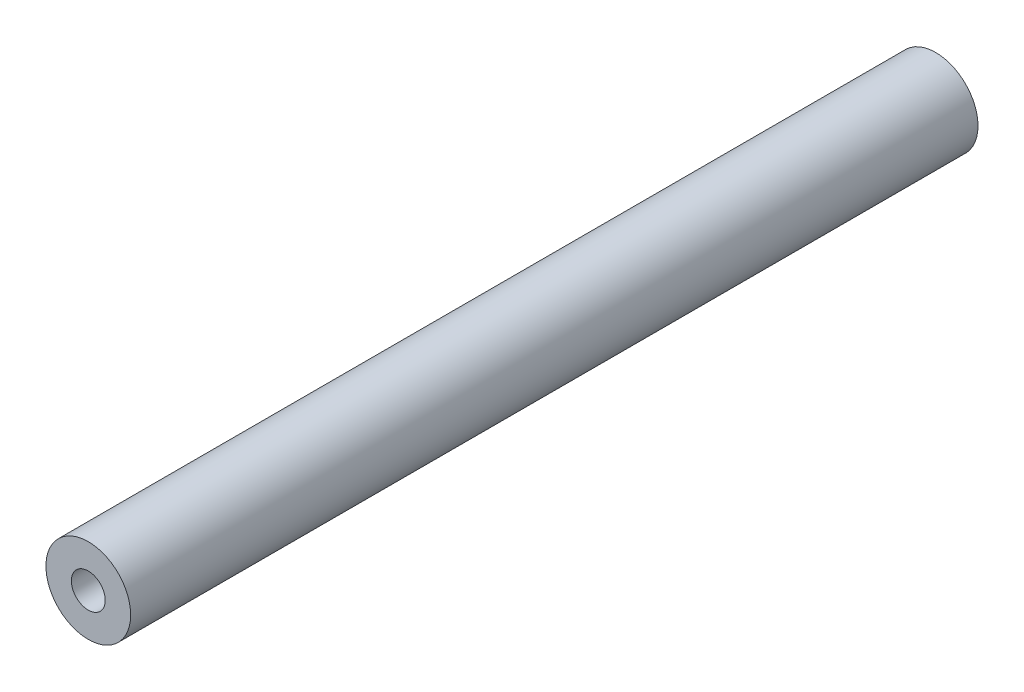
ISO-10303-21;
HEADER;
FILE_DESCRIPTION(('STEP AP214'),'2;1');
FILE_NAME('part.step','',(''),(''),'','','');
FILE_SCHEMA(('AUTOMOTIVE_DESIGN { 1 0 10303 214 1 1 1 1 }'));
ENDSEC;
DATA;
#1=APPLICATION_CONTEXT('core data for automotive mechanical design processes');
#2=APPLICATION_PROTOCOL_DEFINITION('international standard','automotive_design',2000,#1);
#3=PRODUCT_CONTEXT('',#1,'mechanical');
#4=PRODUCT('Part','Part','',(#3));
#5=PRODUCT_RELATED_PRODUCT_CATEGORY('part','',(#4));
#6=PRODUCT_DEFINITION_FORMATION('','',#4);
#7=PRODUCT_DEFINITION_CONTEXT('part definition',#1,'design');
#8=PRODUCT_DEFINITION('design','',#6,#7);
#9=PRODUCT_DEFINITION_SHAPE('','',#8);
#10=(LENGTH_UNIT() NAMED_UNIT(*) SI_UNIT(.MILLI.,.METRE.));
#11=(NAMED_UNIT(*) PLANE_ANGLE_UNIT() SI_UNIT($,.RADIAN.));
#12=(NAMED_UNIT(*) SI_UNIT($,.STERADIAN.) SOLID_ANGLE_UNIT());
#13=UNCERTAINTY_MEASURE_WITH_UNIT(LENGTH_MEASURE(1.E-05),#10,'distance_accuracy_value','');
#14=(GEOMETRIC_REPRESENTATION_CONTEXT(3) GLOBAL_UNCERTAINTY_ASSIGNED_CONTEXT((#13)) GLOBAL_UNIT_ASSIGNED_CONTEXT((#10,
#11,#12)) REPRESENTATION_CONTEXT('',''));
#15=CARTESIAN_POINT('',(0.,0.,0.));
#16=DIRECTION('',(0.,0.,1.));
#17=DIRECTION('',(1.,0.,0.));
#18=AXIS2_PLACEMENT_3D('',#15,#16,#17);
#19=CARTESIAN_POINT('',(0.,0.,60.));
#20=DIRECTION('',(0.,0.,1.));
#21=DIRECTION('',(1.,0.,0.));
#22=AXIS2_PLACEMENT_3D('',#19,#20,#21);
#23=PLANE('',#22);
#24=CARTESIAN_POINT('',(0.,0.,60.));
#25=DIRECTION('',(0.,0.,1.));
#26=DIRECTION('',(1.,0.,0.));
#27=AXIS2_PLACEMENT_3D('',#24,#25,#26);
#28=CIRCLE('',#27,3.);
#29=CARTESIAN_POINT('',(3.,0.,60.));
#30=VERTEX_POINT('',#29);
#31=EDGE_CURVE('E11',#30,#30,#28,.T.);
#32=ORIENTED_EDGE('',*,*,#31,.T.);
#33=EDGE_LOOP('',(#32));
#34=FACE_BOUND('',#33,.T.);
#35=CARTESIAN_POINT('',(0.,0.,60.));
#36=DIRECTION('',(0.,0.,1.));
#37=DIRECTION('',(1.,0.,0.));
#38=AXIS2_PLACEMENT_3D('',#35,#36,#37);
#39=CIRCLE('',#38,1.2);
#40=CARTESIAN_POINT('',(1.2,0.,60.));
#41=VERTEX_POINT('',#40);
#42=EDGE_CURVE('E48',#41,#41,#39,.T.);
#43=ORIENTED_EDGE('',*,*,#42,.F.);
#44=EDGE_LOOP('',(#43));
#45=FACE_BOUND('',#44,.T.);
#46=ADVANCED_FACE('F37',(#34,#45),#23,.T.);
#47=CARTESIAN_POINT('',(0.,0.,0.));
#48=DIRECTION('',(0.,0.,1.));
#49=DIRECTION('',(1.,0.,0.));
#50=AXIS2_PLACEMENT_3D('',#47,#48,#49);
#51=PLANE('',#50);
#52=CARTESIAN_POINT('',(0.,0.,0.));
#53=DIRECTION('',(0.,0.,1.));
#54=DIRECTION('',(1.,0.,0.));
#55=AXIS2_PLACEMENT_3D('',#52,#53,#54);
#56=CIRCLE('',#55,3.);
#57=CARTESIAN_POINT('',(3.,0.,0.));
#58=VERTEX_POINT('',#57);
#59=EDGE_CURVE('E41',#58,#58,#56,.T.);
#60=ORIENTED_EDGE('',*,*,#59,.F.);
#61=EDGE_LOOP('',(#60));
#62=FACE_BOUND('',#61,.T.);
#63=CARTESIAN_POINT('',(0.,0.,0.));
#64=DIRECTION('',(0.,0.,1.));
#65=DIRECTION('',(1.,0.,0.));
#66=AXIS2_PLACEMENT_3D('',#63,#64,#65);
#67=CIRCLE('',#66,1.2);
#68=CARTESIAN_POINT('',(1.2,0.,0.));
#69=VERTEX_POINT('',#68);
#70=EDGE_CURVE('E50',#69,#69,#67,.T.);
#71=ORIENTED_EDGE('',*,*,#70,.T.);
#72=EDGE_LOOP('',(#71));
#73=FACE_BOUND('',#72,.T.);
#74=ADVANCED_FACE('F60',(#62,#73),#51,.F.);
#75=CARTESIAN_POINT('',(0.,0.,60.));
#76=DIRECTION('',(0.,0.,-1.));
#77=DIRECTION('',(-1.,0.,0.));
#78=AXIS2_PLACEMENT_3D('',#75,#76,#77);
#79=CYLINDRICAL_SURFACE('',#78,3.);
#80=ORIENTED_EDGE('',*,*,#31,.F.);
#81=EDGE_LOOP('',(#80));
#82=FACE_BOUND('',#81,.T.);
#83=ORIENTED_EDGE('',*,*,#59,.T.);
#84=EDGE_LOOP('',(#83));
#85=FACE_BOUND('',#84,.T.);
#86=ADVANCED_FACE('F39',(#82,#85),#79,.T.);
#87=CARTESIAN_POINT('',(0.,0.,60.));
#88=DIRECTION('',(0.,0.,-1.));
#89=DIRECTION('',(-1.,0.,0.));
#90=AXIS2_PLACEMENT_3D('',#87,#88,#89);
#91=CYLINDRICAL_SURFACE('',#90,1.2);
#92=ORIENTED_EDGE('',*,*,#42,.T.);
#93=EDGE_LOOP('',(#92));
#94=FACE_BOUND('',#93,.T.);
#95=ORIENTED_EDGE('',*,*,#70,.F.);
#96=EDGE_LOOP('',(#95));
#97=FACE_BOUND('',#96,.T.);
#98=ADVANCED_FACE('F56',(#94,#97),#91,.F.);
#99=CLOSED_SHELL('',(#46,#74,#86,#98));
#100=MANIFOLD_SOLID_BREP('B2',#99);
#101=ADVANCED_BREP_SHAPE_REPRESENTATION('',(#18,#100),#14);
#102=SHAPE_DEFINITION_REPRESENTATION(#9,#101);
ENDSEC;
END-ISO-10303-21;
